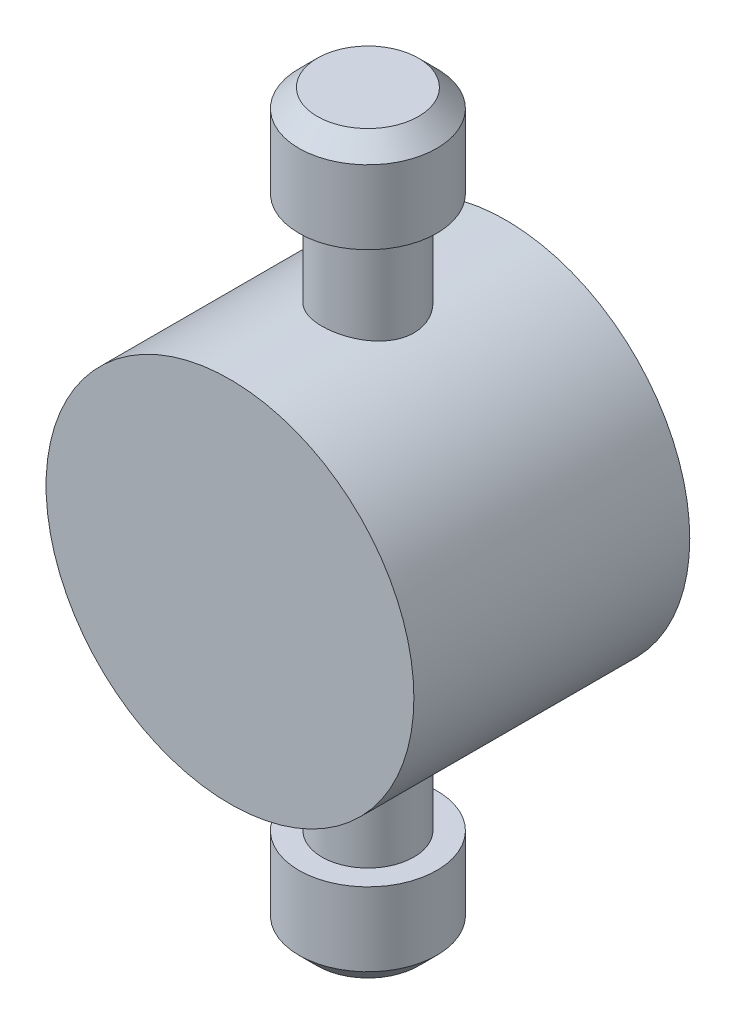
ISO-10303-21;
HEADER;
FILE_DESCRIPTION(('STEP AP214'),'2;1');
FILE_NAME('part.step','',(''),(''),'','','');
FILE_SCHEMA(('AUTOMOTIVE_DESIGN { 1 0 10303 214 1 1 1 1 }'));
ENDSEC;
DATA;
#1=APPLICATION_CONTEXT('core data for automotive mechanical design processes');
#2=APPLICATION_PROTOCOL_DEFINITION('international standard','automotive_design',2000,#1);
#3=PRODUCT_CONTEXT('',#1,'mechanical');
#4=PRODUCT('Part','Part','',(#3));
#5=PRODUCT_RELATED_PRODUCT_CATEGORY('part','',(#4));
#6=PRODUCT_DEFINITION_FORMATION('','',#4);
#7=PRODUCT_DEFINITION_CONTEXT('part definition',#1,'design');
#8=PRODUCT_DEFINITION('design','',#6,#7);
#9=PRODUCT_DEFINITION_SHAPE('','',#8);
#10=(LENGTH_UNIT() NAMED_UNIT(*) SI_UNIT(.MILLI.,.METRE.));
#11=(NAMED_UNIT(*) PLANE_ANGLE_UNIT() SI_UNIT($,.RADIAN.));
#12=(NAMED_UNIT(*) SI_UNIT($,.STERADIAN.) SOLID_ANGLE_UNIT());
#13=UNCERTAINTY_MEASURE_WITH_UNIT(LENGTH_MEASURE(1.E-05),#10,'distance_accuracy_value','');
#14=(GEOMETRIC_REPRESENTATION_CONTEXT(3) GLOBAL_UNCERTAINTY_ASSIGNED_CONTEXT((#13)) GLOBAL_UNIT_ASSIGNED_CONTEXT((#10,
#11,#12)) REPRESENTATION_CONTEXT('',''));
#15=CARTESIAN_POINT('',(0.,0.,0.));
#16=DIRECTION('',(0.,0.,1.));
#17=DIRECTION('',(1.,0.,0.));
#18=AXIS2_PLACEMENT_3D('',#15,#16,#17);
#19=CARTESIAN_POINT('',(0.,0.,15.));
#20=DIRECTION('',(0.,0.,-1.));
#21=DIRECTION('',(-1.,0.,0.));
#22=AXIS2_PLACEMENT_3D('',#19,#20,#21);
#23=CYLINDRICAL_SURFACE('',#22,20.);
#24=CARTESIAN_POINT('',(0.,0.,15.));
#25=DIRECTION('',(0.,0.,1.));
#26=DIRECTION('',(1.,0.,0.));
#27=AXIS2_PLACEMENT_3D('',#24,#25,#26);
#28=CIRCLE('',#27,20.);
#29=CARTESIAN_POINT('',(20.,0.,15.));
#30=VERTEX_POINT('',#29);
#31=EDGE_CURVE('E63',#30,#30,#28,.T.);
#32=ORIENTED_EDGE('',*,*,#31,.F.);
#33=EDGE_LOOP('',(#32));
#34=FACE_BOUND('',#33,.T.);
#35=CARTESIAN_POINT('',(0.,0.,-15.));
#36=DIRECTION('',(0.,0.,1.));
#37=DIRECTION('',(1.,0.,0.));
#38=AXIS2_PLACEMENT_3D('',#35,#36,#37);
#39=CIRCLE('',#38,20.);
#40=CARTESIAN_POINT('',(20.,0.,-15.));
#41=VERTEX_POINT('',#40);
#42=EDGE_CURVE('E64',#41,#41,#39,.T.);
#43=ORIENTED_EDGE('',*,*,#42,.T.);
#44=EDGE_LOOP('',(#43));
#45=FACE_BOUND('',#44,.T.);
#46=CARTESIAN_POINT('',(0.,20.,5.));
#47=CARTESIAN_POINT('',(0.276253628899104,19.9999953289337,4.99999224753947));
#48=CARTESIAN_POINT('',(0.552593859435877,19.9942192710609,4.97702816408737));
#49=CARTESIAN_POINT('',(1.09735441256844,19.9717371276631,4.88591616230998));
#50=CARTESIAN_POINT('',(1.3657701562358,19.9550248473325,4.81774263487383));
#51=CARTESIAN_POINT('',(1.88673624060859,19.9125208777344,4.63853582179305));
#52=CARTESIAN_POINT('',(2.13930521143334,19.8867400947353,4.52755400428244));
#53=CARTESIAN_POINT('',(2.62224043968143,19.8288447935874,4.26606203318386));
#54=CARTESIAN_POINT('',(2.85260594782921,19.7967300618052,4.11555054627011));
#55=CARTESIAN_POINT('',(3.28933975766972,19.7289137863898,3.7759973678194));
#56=CARTESIAN_POINT('',(3.49518563353686,19.6931569049375,3.58629475013646));
#57=CARTESIAN_POINT('',(3.87249642401106,19.6224540039312,3.17515931696989));
#58=CARTESIAN_POINT('',(4.0439574564973,19.5875080763289,2.95372292351021));
#59=CARTESIAN_POINT('',(4.35008847599658,19.5218258566056,2.48134924421003));
#60=CARTESIAN_POINT('',(4.4841740530838,19.4911598154937,2.2300225639709));
#61=CARTESIAN_POINT('',(4.70798969516915,19.4383164939339,1.70750529446655));
#62=CARTESIAN_POINT('',(4.79772685146714,19.4161378564806,1.43631788889328));
#63=CARTESIAN_POINT('',(4.92851612268255,19.3833492232108,0.887521672661134));
#64=CARTESIAN_POINT('',(4.97050756110684,19.372516366567,0.610150346540026));
#65=CARTESIAN_POINT('',(5.00753925022136,19.362978748653,0.0521047700021815));
#66=CARTESIAN_POINT('',(5.0025871393937,19.3642720142643,-0.228568935640457));
#67=CARTESIAN_POINT('',(4.94662174879902,19.3786401838939,-0.778052692484511));
#68=CARTESIAN_POINT('',(4.89672780063545,19.3914287669098,-1.04698540488443));
#69=CARTESIAN_POINT('',(4.75408062300998,19.426890322369,-1.5725368363702));
#70=CARTESIAN_POINT('',(4.66132434023131,19.4495639989746,-1.82915467676307));
#71=CARTESIAN_POINT('',(4.43463159312395,19.5025037968553,-2.3257933875071));
#72=CARTESIAN_POINT('',(4.3002888907764,19.5328442489939,-2.5656205726319));
#73=CARTESIAN_POINT('',(3.99452092004982,19.5976570281997,-3.01972903252274));
#74=CARTESIAN_POINT('',(3.82308916269612,19.6321300778209,-3.23400582689084));
#75=CARTESIAN_POINT('',(3.44221141560407,19.7025293513297,-3.63734538564802));
#76=CARTESIAN_POINT('',(3.23182086055287,19.7384689826,-3.82551496687117));
#77=CARTESIAN_POINT('',(2.78203972501233,19.8068655192919,-4.16407080821301));
#78=CARTESIAN_POINT('',(2.54264825902648,19.8393223183136,-4.31445591421189));
#79=CARTESIAN_POINT('',(2.04038629560464,19.897257736473,-4.57350195408129));
#80=CARTESIAN_POINT('',(1.77743797736208,19.9227120042576,-4.68201780084809));
#81=CARTESIAN_POINT('',(1.23625336047628,19.9635972330472,-4.85305768569858));
#82=CARTESIAN_POINT('',(0.958019997168281,19.9790301113094,-4.91559052139379));
#83=CARTESIAN_POINT('',(0.401799901300088,19.9978499757125,-4.99152521852946));
#84=CARTESIAN_POINT('',(0.123989066627364,20.0015351169426,-5.00614342025101));
#85=CARTESIAN_POINT('',(-0.430109582671697,19.9972934938151,-4.98916999314837));
#86=CARTESIAN_POINT('',(-0.706397532148656,19.9893677747284,-4.95758252400288));
#87=CARTESIAN_POINT('',(-1.24538089592164,19.9629860375783,-4.85009697202875));
#88=CARTESIAN_POINT('',(-1.50821706322917,19.9446878061929,-4.77486245507675));
#89=CARTESIAN_POINT('',(-2.01752430817505,19.899623554472,-4.5829763865718));
#90=CARTESIAN_POINT('',(-2.26399373010884,19.8728566789995,-4.46632065228926));
#91=CARTESIAN_POINT('',(-2.73841044809943,19.8131102642072,-4.19254623708441));
#92=CARTESIAN_POINT('',(-2.96595147278588,19.7800289122193,-4.03474629201144));
#93=CARTESIAN_POINT('',(-3.39175537881104,19.7114836395924,-3.68403363734278));
#94=CARTESIAN_POINT('',(-3.59001319657751,19.676019308434,-3.49111486794122));
#95=CARTESIAN_POINT('',(-3.95663522690827,19.6056318986475,-3.06999346385426));
#96=CARTESIAN_POINT('',(-4.12414622540362,19.57074347274,-2.84104099000128));
#97=CARTESIAN_POINT('',(-4.41836919671214,19.5064292794107,-2.35755788510492));
#98=CARTESIAN_POINT('',(-4.54508298053823,19.4770032695336,-2.10302839009921));
#99=CARTESIAN_POINT('',(-4.75317140202426,19.4272698238587,-1.57698092531186));
#100=CARTESIAN_POINT('',(-4.83481465547784,19.4069085073875,-1.30557457228981));
#101=CARTESIAN_POINT('',(-4.95115219981056,19.3775581342603,-0.752301207151547));
#102=CARTESIAN_POINT('',(-4.98585675825595,19.3685665905607,-0.470436496604616));
#103=CARTESIAN_POINT('',(-5.00679530111928,19.3631633735661,0.0870700795596853));
#104=CARTESIAN_POINT('',(-4.99439299259115,19.366397756045,0.362658117145653));
#105=CARTESIAN_POINT('',(-4.92459092769654,19.3842636317313,0.907679628938991));
#106=CARTESIAN_POINT('',(-4.86719207562106,19.3988948958968,1.17711322671953));
#107=CARTESIAN_POINT('',(-4.70977106481402,19.4377086899188,1.70069486353336));
#108=CARTESIAN_POINT('',(-4.61000468226918,19.461833841343,1.95492435079587));
#109=CARTESIAN_POINT('',(-4.37088304534897,19.5169251906949,2.4432179423838));
#110=CARTESIAN_POINT('',(-4.23152230011362,19.5478923373231,2.6772792439577));
#111=CARTESIAN_POINT('',(-3.91289249545747,19.6141878088207,3.12518209667206));
#112=CARTESIAN_POINT('',(-3.73267720970761,19.6496088277351,3.33833691141284));
#113=CARTESIAN_POINT('',(-3.33929790396569,19.7202675748663,3.73182348265172));
#114=CARTESIAN_POINT('',(-3.12612607087046,19.755505257566,3.91214743370999));
#115=CARTESIAN_POINT('',(-2.66822528900866,19.8225885215915,4.23803769521526));
#116=CARTESIAN_POINT('',(-2.42299474105463,19.8543611121963,4.38291537890524));
#117=CARTESIAN_POINT('',(-1.91088686503491,19.9101641658366,4.62915820980179));
#118=CARTESIAN_POINT('',(-1.64402521145579,19.9342001733259,4.73055453549513));
#119=CARTESIAN_POINT('',(-1.14803417747824,19.9682686521849,4.87190610109884));
#120=CARTESIAN_POINT('',(-0.921267236360227,19.9800861684231,4.91983747684478));
#121=CARTESIAN_POINT('',(-0.463020238454276,19.9959535077316,4.98388647873981));
#122=CARTESIAN_POINT('',(-0.231540537475387,20.0000039150298,5.00000649768434));
#123=CARTESIAN_POINT('',(0.,20.,5.));
#124=B_SPLINE_CURVE_WITH_KNOTS('',3,(#46,#47,#48,#49,#50,#51,#52,#53,#54,#55,#56,#57,#58,#59,
#60,#61,#62,#63,#64,#65,#66,#67,#68,#69,#70,#71,#72,#73,#74,#75,#76,#77,#78,#79,#80,#81,#82,#83,
#84,#85,#86,#87,#88,#89,#90,#91,#92,#93,#94,#95,#96,#97,#98,#99,#100,#101,#102,#103,#104,#105,
#106,#107,#108,#109,#110,#111,#112,#113,#114,#115,#116,#117,#118,#119,#120,#121,#122,#123),
.UNSPECIFIED.,.T.,.F.,(4,2,2,2,2,2,2,2,2,2,2,2,2,2,2,2,2,2,2,2,2,2,2,2,2,2,2,2,2,2,2,2,2,2,2,2,
2,2,4),(0.,0.827912374906299,1.65629412587967,2.48368300762035,3.31109980056443,4.1538145145713,
4.9966243193354,5.85195491819356,6.70714870564561,7.54520983670233,8.38313460386725,
9.20074990034463,10.0184234489786,10.84435092924,11.6704230279828,12.5200500324113,
13.3697029853856,14.2222743004145,15.0746824563988,15.9052769650866,16.7357967038688,
17.5540091505786,18.372304244187,19.2051195856224,20.0380787670447,20.8914836402599,
21.7448506250943,22.5930751539527,23.4411141086095,24.2647926801851,25.0884546987996,
25.9072133522467,26.7260856048285,27.5663192139288,28.4067523259457,29.2624061835847,
30.1174454609768,30.8114080983367,31.5053185350331),.UNSPECIFIED.);
#125=CARTESIAN_POINT('',(0.,20.,5.));
#126=VERTEX_POINT('',#125);
#127=EDGE_CURVE('E54',#126,#126,#124,.T.);
#128=ORIENTED_EDGE('',*,*,#127,.F.);
#129=EDGE_LOOP('',(#128));
#130=FACE_BOUND('',#129,.T.);
#131=CARTESIAN_POINT('',(0.,-20.,5.));
#132=CARTESIAN_POINT('',(-0.276253628899104,-19.9999953289337,4.99999224753947));
#133=CARTESIAN_POINT('',(-0.552593859435877,-19.9942192710609,4.97702816408737));
#134=CARTESIAN_POINT('',(-1.09735441256844,-19.9717371276631,4.88591616230998));
#135=CARTESIAN_POINT('',(-1.3657701562358,-19.9550248473325,4.81774263487383));
#136=CARTESIAN_POINT('',(-1.88673624060859,-19.9125208777344,4.63853582179305));
#137=CARTESIAN_POINT('',(-2.13930521143334,-19.8867400947353,4.52755400428244));
#138=CARTESIAN_POINT('',(-2.62224043968143,-19.8288447935874,4.26606203318386));
#139=CARTESIAN_POINT('',(-2.85260594782921,-19.7967300618052,4.11555054627011));
#140=CARTESIAN_POINT('',(-3.28933975766972,-19.7289137863898,3.7759973678194));
#141=CARTESIAN_POINT('',(-3.49518563353686,-19.6931569049375,3.58629475013646));
#142=CARTESIAN_POINT('',(-3.87249642401106,-19.6224540039312,3.17515931696989));
#143=CARTESIAN_POINT('',(-4.0439574564973,-19.5875080763289,2.95372292351021));
#144=CARTESIAN_POINT('',(-4.35008847599658,-19.5218258566056,2.48134924421003));
#145=CARTESIAN_POINT('',(-4.4841740530838,-19.4911598154937,2.2300225639709));
#146=CARTESIAN_POINT('',(-4.70798969516915,-19.4383164939339,1.70750529446655));
#147=CARTESIAN_POINT('',(-4.79772685146714,-19.4161378564806,1.43631788889328));
#148=CARTESIAN_POINT('',(-4.92851612268255,-19.3833492232108,0.887521672661134));
#149=CARTESIAN_POINT('',(-4.97050756110684,-19.372516366567,0.610150346540026));
#150=CARTESIAN_POINT('',(-5.00753925022136,-19.362978748653,0.0521047700021815));
#151=CARTESIAN_POINT('',(-5.0025871393937,-19.3642720142643,-0.228568935640457));
#152=CARTESIAN_POINT('',(-4.94662174879902,-19.3786401838939,-0.778052692484511));
#153=CARTESIAN_POINT('',(-4.89672780063545,-19.3914287669098,-1.04698540488443));
#154=CARTESIAN_POINT('',(-4.75408062300998,-19.426890322369,-1.5725368363702));
#155=CARTESIAN_POINT('',(-4.66132434023131,-19.4495639989746,-1.82915467676307));
#156=CARTESIAN_POINT('',(-4.43463159312395,-19.5025037968553,-2.3257933875071));
#157=CARTESIAN_POINT('',(-4.3002888907764,-19.5328442489939,-2.5656205726319));
#158=CARTESIAN_POINT('',(-3.99452092004982,-19.5976570281997,-3.01972903252274));
#159=CARTESIAN_POINT('',(-3.82308916269612,-19.6321300778209,-3.23400582689084));
#160=CARTESIAN_POINT('',(-3.44221141560407,-19.7025293513297,-3.63734538564802));
#161=CARTESIAN_POINT('',(-3.23182086055287,-19.7384689826,-3.82551496687117));
#162=CARTESIAN_POINT('',(-2.78203972501233,-19.8068655192919,-4.16407080821301));
#163=CARTESIAN_POINT('',(-2.54264825902648,-19.8393223183136,-4.31445591421189));
#164=CARTESIAN_POINT('',(-2.04038629560464,-19.897257736473,-4.57350195408129));
#165=CARTESIAN_POINT('',(-1.77743797736208,-19.9227120042576,-4.68201780084809));
#166=CARTESIAN_POINT('',(-1.23625336047628,-19.9635972330472,-4.85305768569858));
#167=CARTESIAN_POINT('',(-0.958019997168281,-19.9790301113094,-4.91559052139379));
#168=CARTESIAN_POINT('',(-0.401799901300088,-19.9978499757125,-4.99152521852946));
#169=CARTESIAN_POINT('',(-0.123989066627364,-20.0015351169426,-5.00614342025101));
#170=CARTESIAN_POINT('',(0.430109582671697,-19.9972934938151,-4.98916999314837));
#171=CARTESIAN_POINT('',(0.706397532148656,-19.9893677747284,-4.95758252400288));
#172=CARTESIAN_POINT('',(1.24538089592164,-19.9629860375783,-4.85009697202875));
#173=CARTESIAN_POINT('',(1.50821706322917,-19.9446878061929,-4.77486245507675));
#174=CARTESIAN_POINT('',(2.01752430817505,-19.899623554472,-4.5829763865718));
#175=CARTESIAN_POINT('',(2.26399373010884,-19.8728566789995,-4.46632065228926));
#176=CARTESIAN_POINT('',(2.73841044809943,-19.8131102642072,-4.19254623708441));
#177=CARTESIAN_POINT('',(2.96595147278588,-19.7800289122193,-4.03474629201144));
#178=CARTESIAN_POINT('',(3.39175537881104,-19.7114836395924,-3.68403363734278));
#179=CARTESIAN_POINT('',(3.59001319657751,-19.676019308434,-3.49111486794122));
#180=CARTESIAN_POINT('',(3.95663522690827,-19.6056318986475,-3.06999346385426));
#181=CARTESIAN_POINT('',(4.12414622540362,-19.57074347274,-2.84104099000128));
#182=CARTESIAN_POINT('',(4.41836919671214,-19.5064292794107,-2.35755788510492));
#183=CARTESIAN_POINT('',(4.54508298053823,-19.4770032695336,-2.10302839009921));
#184=CARTESIAN_POINT('',(4.75317140202426,-19.4272698238587,-1.57698092531186));
#185=CARTESIAN_POINT('',(4.83481465547784,-19.4069085073875,-1.30557457228981));
#186=CARTESIAN_POINT('',(4.95115219981056,-19.3775581342603,-0.752301207151547));
#187=CARTESIAN_POINT('',(4.98585675825595,-19.3685665905607,-0.470436496604616));
#188=CARTESIAN_POINT('',(5.00679530111928,-19.3631633735661,0.0870700795596853));
#189=CARTESIAN_POINT('',(4.99439299259115,-19.366397756045,0.362658117145653));
#190=CARTESIAN_POINT('',(4.92459092769654,-19.3842636317313,0.907679628938991));
#191=CARTESIAN_POINT('',(4.86719207562106,-19.3988948958968,1.17711322671953));
#192=CARTESIAN_POINT('',(4.70977106481402,-19.4377086899188,1.70069486353336));
#193=CARTESIAN_POINT('',(4.61000468226918,-19.461833841343,1.95492435079587));
#194=CARTESIAN_POINT('',(4.37088304534897,-19.5169251906949,2.4432179423838));
#195=CARTESIAN_POINT('',(4.23152230011362,-19.5478923373231,2.6772792439577));
#196=CARTESIAN_POINT('',(3.91289249545747,-19.6141878088207,3.12518209667206));
#197=CARTESIAN_POINT('',(3.73267720970761,-19.6496088277351,3.33833691141284));
#198=CARTESIAN_POINT('',(3.33929790396569,-19.7202675748663,3.73182348265172));
#199=CARTESIAN_POINT('',(3.12612607087046,-19.755505257566,3.91214743370999));
#200=CARTESIAN_POINT('',(2.66822528900866,-19.8225885215915,4.23803769521526));
#201=CARTESIAN_POINT('',(2.42299474105463,-19.8543611121963,4.38291537890524));
#202=CARTESIAN_POINT('',(1.91088686503491,-19.9101641658366,4.62915820980179));
#203=CARTESIAN_POINT('',(1.64402521145579,-19.9342001733259,4.73055453549513));
#204=CARTESIAN_POINT('',(1.14803417747824,-19.9682686521849,4.87190610109884));
#205=CARTESIAN_POINT('',(0.921267236360227,-19.9800861684231,4.91983747684478));
#206=CARTESIAN_POINT('',(0.463020238454276,-19.9959535077316,4.98388647873981));
#207=CARTESIAN_POINT('',(0.231540537475387,-20.0000039150298,5.00000649768434));
#208=CARTESIAN_POINT('',(0.,-20.,5.));
#209=B_SPLINE_CURVE_WITH_KNOTS('',3,(#131,#132,#133,#134,#135,#136,#137,#138,#139,#140,#141,
#142,#143,#144,#145,#146,#147,#148,#149,#150,#151,#152,#153,#154,#155,#156,#157,#158,#159,#160,
#161,#162,#163,#164,#165,#166,#167,#168,#169,#170,#171,#172,#173,#174,#175,#176,#177,#178,#179,
#180,#181,#182,#183,#184,#185,#186,#187,#188,#189,#190,#191,#192,#193,#194,#195,#196,#197,#198,
#199,#200,#201,#202,#203,#204,#205,#206,#207,#208),.UNSPECIFIED.,.T.,.F.,(4,2,2,2,2,2,2,2,2,2,2,
2,2,2,2,2,2,2,2,2,2,2,2,2,2,2,2,2,2,2,2,2,2,2,2,2,2,2,4),(0.,0.827912374906299,1.65629412587967,
2.48368300762035,3.31109980056443,4.1538145145713,4.9966243193354,5.85195491819356,
6.70714870564561,7.54520983670233,8.38313460386725,9.20074990034463,10.0184234489786,
10.84435092924,11.6704230279828,12.5200500324113,13.3697029853856,14.2222743004145,
15.0746824563988,15.9052769650866,16.7357967038688,17.5540091505786,18.372304244187,
19.2051195856224,20.0380787670447,20.8914836402599,21.7448506250943,22.5930751539527,
23.4411141086095,24.2647926801851,25.0884546987996,25.9072133522467,26.7260856048285,
27.5663192139288,28.4067523259457,29.2624061835847,30.1174454609768,30.8114080983367,
31.5053185350331),.UNSPECIFIED.);
#210=CARTESIAN_POINT('',(0.,-20.,5.));
#211=VERTEX_POINT('',#210);
#212=EDGE_CURVE('E10',#211,#211,#209,.T.);
#213=ORIENTED_EDGE('',*,*,#212,.F.);
#214=EDGE_LOOP('',(#213));
#215=FACE_BOUND('',#214,.T.);
#216=ADVANCED_FACE('F34',(#34,#45,#130,#215),#23,.T.);
#217=CARTESIAN_POINT('',(0.,0.,15.));
#218=DIRECTION('',(0.,0.,1.));
#219=DIRECTION('',(1.,0.,0.));
#220=AXIS2_PLACEMENT_3D('',#217,#218,#219);
#221=PLANE('',#220);
#222=ORIENTED_EDGE('',*,*,#31,.T.);
#223=EDGE_LOOP('',(#222));
#224=FACE_BOUND('',#223,.T.);
#225=ADVANCED_FACE('F77',(#224),#221,.T.);
#226=CARTESIAN_POINT('',(0.,0.,-15.));
#227=DIRECTION('',(0.,0.,1.));
#228=DIRECTION('',(1.,0.,0.));
#229=AXIS2_PLACEMENT_3D('',#226,#227,#228);
#230=PLANE('',#229);
#231=CARTESIAN_POINT('',(0.,0.,-15.));
#232=DIRECTION('',(0.,0.,-1.));
#233=DIRECTION('',(-1.,0.,0.));
#234=AXIS2_PLACEMENT_3D('',#231,#232,#233);
#235=CIRCLE('',#234,5.);
#236=CARTESIAN_POINT('',(-5.,0.,-15.));
#237=VERTEX_POINT('',#236);
#238=EDGE_CURVE('E120',#237,#237,#235,.T.);
#239=ORIENTED_EDGE('',*,*,#238,.F.);
#240=EDGE_LOOP('',(#239));
#241=FACE_BOUND('',#240,.T.);
#242=ORIENTED_EDGE('',*,*,#42,.F.);
#243=EDGE_LOOP('',(#242));
#244=FACE_BOUND('',#243,.T.);
#245=ADVANCED_FACE('F74',(#241,#244),#230,.F.);
#246=CARTESIAN_POINT('',(0.,-20.001,0.));
#247=DIRECTION('',(0.,1.,0.));
#248=DIRECTION('',(0.,0.,1.));
#249=AXIS2_PLACEMENT_3D('',#246,#247,#248);
#250=CYLINDRICAL_SURFACE('',#249,5.);
#251=CARTESIAN_POINT('',(0.,30.,0.));
#252=DIRECTION('',(0.,-1.,0.));
#253=DIRECTION('',(0.,0.,-1.));
#254=AXIS2_PLACEMENT_3D('',#251,#252,#253);
#255=CIRCLE('',#254,5.);
#256=CARTESIAN_POINT('',(0.,30.,-5.));
#257=VERTEX_POINT('',#256);
#258=EDGE_CURVE('E99',#257,#257,#255,.T.);
#259=ORIENTED_EDGE('',*,*,#258,.T.);
#260=EDGE_LOOP('',(#259));
#261=FACE_BOUND('',#260,.T.);
#262=ORIENTED_EDGE('',*,*,#127,.T.);
#263=EDGE_LOOP('',(#262));
#264=FACE_BOUND('',#263,.T.);
#265=ADVANCED_FACE('F68',(#261,#264),#250,.T.);
#266=CARTESIAN_POINT('',(0.,30.,0.));
#267=DIRECTION('',(0.,1.,0.));
#268=DIRECTION('',(0.,0.,1.));
#269=AXIS2_PLACEMENT_3D('',#266,#267,#268);
#270=CYLINDRICAL_SURFACE('',#269,7.5);
#271=CARTESIAN_POINT('',(0.,38.,0.));
#272=DIRECTION('',(0.,1.,0.));
#273=DIRECTION('',(0.,0.,1.));
#274=AXIS2_PLACEMENT_3D('',#271,#272,#273);
#275=CIRCLE('',#274,7.5);
#276=CARTESIAN_POINT('',(0.,38.,7.5));
#277=VERTEX_POINT('',#276);
#278=EDGE_CURVE('E46',#277,#277,#275,.F.);
#279=ORIENTED_EDGE('',*,*,#278,.T.);
#280=EDGE_LOOP('',(#279));
#281=FACE_BOUND('',#280,.T.);
#282=CARTESIAN_POINT('',(0.,30.,0.));
#283=DIRECTION('',(0.,1.,0.));
#284=DIRECTION('',(0.,0.,1.));
#285=AXIS2_PLACEMENT_3D('',#282,#283,#284);
#286=CIRCLE('',#285,7.5);
#287=CARTESIAN_POINT('',(0.,30.,7.5));
#288=VERTEX_POINT('',#287);
#289=EDGE_CURVE('E101',#288,#288,#286,.T.);
#290=ORIENTED_EDGE('',*,*,#289,.T.);
#291=EDGE_LOOP('',(#290));
#292=FACE_BOUND('',#291,.T.);
#293=ADVANCED_FACE('F73',(#281,#292),#270,.T.);
#294=CARTESIAN_POINT('',(0.,30.,0.));
#295=DIRECTION('',(0.,1.,0.));
#296=DIRECTION('',(0.,0.,1.));
#297=AXIS2_PLACEMENT_3D('',#294,#295,#296);
#298=PLANE('',#297);
#299=ORIENTED_EDGE('',*,*,#258,.F.);
#300=EDGE_LOOP('',(#299));
#301=FACE_BOUND('',#300,.T.);
#302=ORIENTED_EDGE('',*,*,#289,.F.);
#303=EDGE_LOOP('',(#302));
#304=FACE_BOUND('',#303,.T.);
#305=ADVANCED_FACE('F157',(#301,#304),#298,.F.);
#306=CARTESIAN_POINT('',(0.,40.,0.));
#307=DIRECTION('',(0.,1.,0.));
#308=DIRECTION('',(0.,0.,1.));
#309=AXIS2_PLACEMENT_3D('',#306,#307,#308);
#310=PLANE('',#309);
#311=CARTESIAN_POINT('',(0.,40.,0.));
#312=DIRECTION('',(0.,1.,0.));
#313=DIRECTION('',(0.,0.,1.));
#314=AXIS2_PLACEMENT_3D('',#311,#312,#313);
#315=CIRCLE('',#314,5.49999999999999);
#316=CARTESIAN_POINT('',(0.,40.,5.49999999999999));
#317=VERTEX_POINT('',#316);
#318=EDGE_CURVE('E50',#317,#317,#315,.T.);
#319=ORIENTED_EDGE('',*,*,#318,.T.);
#320=EDGE_LOOP('',(#319));
#321=FACE_BOUND('',#320,.T.);
#322=ADVANCED_FACE('F159',(#321),#310,.T.);
#323=CARTESIAN_POINT('',(0.,40.,0.));
#324=DIRECTION('',(0.,-1.,0.));
#325=DIRECTION('',(0.,0.,-1.));
#326=AXIS2_PLACEMENT_3D('',#323,#324,#325);
#327=CONICAL_SURFACE('',#326,5.49999999999999,0.785398163397447);
#328=ORIENTED_EDGE('',*,*,#278,.F.);
#329=EDGE_LOOP('',(#328));
#330=FACE_BOUND('',#329,.T.);
#331=ORIENTED_EDGE('',*,*,#318,.F.);
#332=EDGE_LOOP('',(#331));
#333=FACE_BOUND('',#332,.T.);
#334=ADVANCED_FACE('F37',(#330,#333),#327,.T.);
#335=CARTESIAN_POINT('',(0.,20.001,0.));
#336=DIRECTION('',(0.,-1.,0.));
#337=DIRECTION('',(0.,0.,1.));
#338=AXIS2_PLACEMENT_3D('',#335,#336,#337);
#339=CYLINDRICAL_SURFACE('',#338,5.);
#340=CARTESIAN_POINT('',(0.,-30.,0.));
#341=DIRECTION('',(0.,-1.,0.));
#342=DIRECTION('',(0.,0.,-1.));
#343=AXIS2_PLACEMENT_3D('',#340,#341,#342);
#344=CIRCLE('',#343,5.);
#345=CARTESIAN_POINT('',(0.,-30.,-5.));
#346=VERTEX_POINT('',#345);
#347=EDGE_CURVE('E113',#346,#346,#344,.T.);
#348=ORIENTED_EDGE('',*,*,#347,.F.);
#349=EDGE_LOOP('',(#348));
#350=FACE_BOUND('',#349,.T.);
#351=ORIENTED_EDGE('',*,*,#212,.T.);
#352=EDGE_LOOP('',(#351));
#353=FACE_BOUND('',#352,.T.);
#354=ADVANCED_FACE('F151',(#350,#353),#339,.T.);
#355=CARTESIAN_POINT('',(0.,-30.,0.));
#356=DIRECTION('',(0.,-1.,0.));
#357=DIRECTION('',(0.,0.,1.));
#358=AXIS2_PLACEMENT_3D('',#355,#356,#357);
#359=CYLINDRICAL_SURFACE('',#358,7.5);
#360=CARTESIAN_POINT('',(0.,-38.,0.));
#361=DIRECTION('',(0.,1.,0.));
#362=DIRECTION('',(0.,0.,1.));
#363=AXIS2_PLACEMENT_3D('',#360,#361,#362);
#364=CIRCLE('',#363,7.5);
#365=CARTESIAN_POINT('',(0.,-38.,7.5));
#366=VERTEX_POINT('',#365);
#367=EDGE_CURVE('E105',#366,#366,#364,.F.);
#368=ORIENTED_EDGE('',*,*,#367,.F.);
#369=EDGE_LOOP('',(#368));
#370=FACE_BOUND('',#369,.T.);
#371=CARTESIAN_POINT('',(0.,-30.,0.));
#372=DIRECTION('',(0.,1.,0.));
#373=DIRECTION('',(0.,0.,1.));
#374=AXIS2_PLACEMENT_3D('',#371,#372,#373);
#375=CIRCLE('',#374,7.5);
#376=CARTESIAN_POINT('',(0.,-30.,7.5));
#377=VERTEX_POINT('',#376);
#378=EDGE_CURVE('E116',#377,#377,#375,.T.);
#379=ORIENTED_EDGE('',*,*,#378,.F.);
#380=EDGE_LOOP('',(#379));
#381=FACE_BOUND('',#380,.T.);
#382=ADVANCED_FACE('F145',(#370,#381),#359,.T.);
#383=CARTESIAN_POINT('',(0.,-30.,0.));
#384=DIRECTION('',(0.,-1.,0.));
#385=DIRECTION('',(0.,0.,1.));
#386=AXIS2_PLACEMENT_3D('',#383,#384,#385);
#387=PLANE('',#386);
#388=ORIENTED_EDGE('',*,*,#347,.T.);
#389=EDGE_LOOP('',(#388));
#390=FACE_BOUND('',#389,.T.);
#391=ORIENTED_EDGE('',*,*,#378,.T.);
#392=EDGE_LOOP('',(#391));
#393=FACE_BOUND('',#392,.T.);
#394=ADVANCED_FACE('F142',(#390,#393),#387,.F.);
#395=CARTESIAN_POINT('',(0.,-40.,0.));
#396=DIRECTION('',(0.,-1.,0.));
#397=DIRECTION('',(0.,0.,1.));
#398=AXIS2_PLACEMENT_3D('',#395,#396,#397);
#399=PLANE('',#398);
#400=CARTESIAN_POINT('',(0.,-40.,0.));
#401=DIRECTION('',(0.,1.,0.));
#402=DIRECTION('',(0.,0.,1.));
#403=AXIS2_PLACEMENT_3D('',#400,#401,#402);
#404=CIRCLE('',#403,5.49999999999999);
#405=CARTESIAN_POINT('',(0.,-40.,5.49999999999999));
#406=VERTEX_POINT('',#405);
#407=EDGE_CURVE('E110',#406,#406,#404,.T.);
#408=ORIENTED_EDGE('',*,*,#407,.F.);
#409=EDGE_LOOP('',(#408));
#410=FACE_BOUND('',#409,.T.);
#411=ADVANCED_FACE('F138',(#410),#399,.T.);
#412=CARTESIAN_POINT('',(0.,-40.,0.));
#413=DIRECTION('',(0.,1.,0.));
#414=DIRECTION('',(0.,0.,-1.));
#415=AXIS2_PLACEMENT_3D('',#412,#413,#414);
#416=CONICAL_SURFACE('',#415,5.49999999999999,0.785398163397447);
#417=ORIENTED_EDGE('',*,*,#367,.T.);
#418=EDGE_LOOP('',(#417));
#419=FACE_BOUND('',#418,.T.);
#420=ORIENTED_EDGE('',*,*,#407,.T.);
#421=EDGE_LOOP('',(#420));
#422=FACE_BOUND('',#421,.T.);
#423=ADVANCED_FACE('F131',(#419,#422),#416,.T.);
#424=CARTESIAN_POINT('',(0.,0.,-5.));
#425=DIRECTION('',(0.,0.,-1.));
#426=DIRECTION('',(-1.,0.,0.));
#427=AXIS2_PLACEMENT_3D('',#424,#425,#426);
#428=CYLINDRICAL_SURFACE('',#427,5.);
#429=CARTESIAN_POINT('',(0.,0.,-5.));
#430=DIRECTION('',(0.,0.,-1.));
#431=DIRECTION('',(-1.,0.,0.));
#432=AXIS2_PLACEMENT_3D('',#429,#430,#431);
#433=CIRCLE('',#432,5.);
#434=CARTESIAN_POINT('',(-5.,0.,-5.));
#435=VERTEX_POINT('',#434);
#436=EDGE_CURVE('E119',#435,#435,#433,.T.);
#437=ORIENTED_EDGE('',*,*,#436,.F.);
#438=EDGE_LOOP('',(#437));
#439=FACE_BOUND('',#438,.T.);
#440=ORIENTED_EDGE('',*,*,#238,.T.);
#441=EDGE_LOOP('',(#440));
#442=FACE_BOUND('',#441,.T.);
#443=ADVANCED_FACE('F128',(#439,#442),#428,.F.);
#444=CARTESIAN_POINT('',(0.,0.,-5.));
#445=DIRECTION('',(0.,0.,-1.));
#446=DIRECTION('',(-1.,0.,0.));
#447=AXIS2_PLACEMENT_3D('',#444,#445,#446);
#448=PLANE('',#447);
#449=ORIENTED_EDGE('',*,*,#436,.T.);
#450=EDGE_LOOP('',(#449));
#451=FACE_BOUND('',#450,.T.);
#452=ADVANCED_FACE('F126',(#451),#448,.T.);
#453=CLOSED_SHELL('',(#216,#225,#245,#265,#293,#305,#322,#334,#354,#382,#394,#411,#423,#443,#452));
#454=MANIFOLD_SOLID_BREP('B2',#453);
#455=ADVANCED_BREP_SHAPE_REPRESENTATION('',(#18,#454),#14);
#456=SHAPE_DEFINITION_REPRESENTATION(#9,#455);
ENDSEC;
END-ISO-10303-21;
